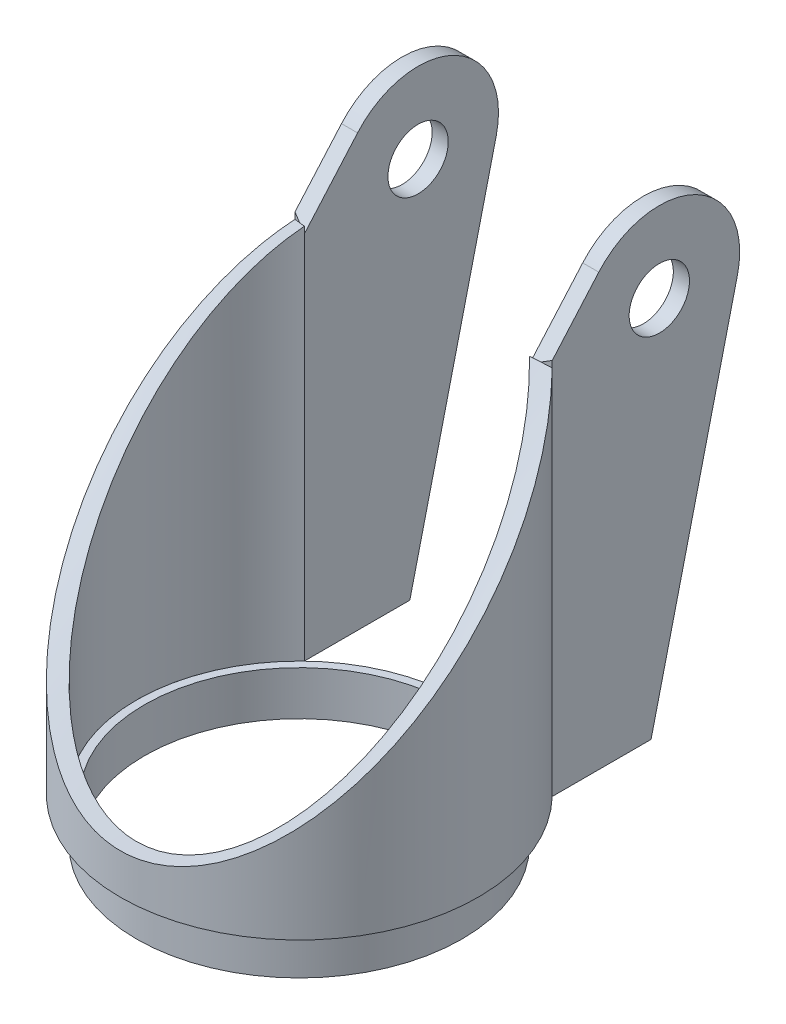
ISO-10303-21;
HEADER;
FILE_DESCRIPTION(('STEP AP214'),'2;1');
FILE_NAME('part.step','',(''),(''),'','','');
FILE_SCHEMA(('AUTOMOTIVE_DESIGN { 1 0 10303 214 1 1 1 1 }'));
ENDSEC;
DATA;
#1=APPLICATION_CONTEXT('core data for automotive mechanical design processes');
#2=APPLICATION_PROTOCOL_DEFINITION('international standard','automotive_design',2000,#1);
#3=PRODUCT_CONTEXT('',#1,'mechanical');
#4=PRODUCT('Part','Part','',(#3));
#5=PRODUCT_RELATED_PRODUCT_CATEGORY('part','',(#4));
#6=PRODUCT_DEFINITION_FORMATION('','',#4);
#7=PRODUCT_DEFINITION_CONTEXT('part definition',#1,'design');
#8=PRODUCT_DEFINITION('design','',#6,#7);
#9=PRODUCT_DEFINITION_SHAPE('','',#8);
#10=(LENGTH_UNIT() NAMED_UNIT(*) SI_UNIT(.MILLI.,.METRE.));
#11=(NAMED_UNIT(*) PLANE_ANGLE_UNIT() SI_UNIT($,.RADIAN.));
#12=(NAMED_UNIT(*) SI_UNIT($,.STERADIAN.) SOLID_ANGLE_UNIT());
#13=UNCERTAINTY_MEASURE_WITH_UNIT(LENGTH_MEASURE(1.E-05),#10,'distance_accuracy_value','');
#14=(GEOMETRIC_REPRESENTATION_CONTEXT(3) GLOBAL_UNCERTAINTY_ASSIGNED_CONTEXT((#13)) GLOBAL_UNIT_ASSIGNED_CONTEXT((#10,
#11,#12)) REPRESENTATION_CONTEXT('',''));
#15=CARTESIAN_POINT('',(0.,0.,0.));
#16=DIRECTION('',(0.,0.,1.));
#17=DIRECTION('',(1.,0.,0.));
#18=AXIS2_PLACEMENT_3D('',#15,#16,#17);
#19=CARTESIAN_POINT('',(0.,-11.,0.));
#20=DIRECTION('',(0.,-1.,0.));
#21=DIRECTION('',(0.,0.,-1.));
#22=AXIS2_PLACEMENT_3D('',#19,#20,#21);
#23=PLANE('',#22);
#24=CARTESIAN_POINT('',(0.,-11.,0.));
#25=DIRECTION('',(0.,-1.,0.));
#26=DIRECTION('',(0.,0.,-1.));
#27=AXIS2_PLACEMENT_3D('',#24,#25,#26);
#28=CIRCLE('',#27,40.5);
#29=CARTESIAN_POINT('',(0.,-11.,-40.5));
#30=VERTEX_POINT('',#29);
#31=EDGE_CURVE('E12',#30,#30,#28,.T.);
#32=ORIENTED_EDGE('',*,*,#31,.T.);
#33=EDGE_LOOP('',(#32));
#34=FACE_BOUND('',#33,.T.);
#35=CARTESIAN_POINT('',(0.,-11.,0.));
#36=DIRECTION('',(0.,-1.,0.));
#37=DIRECTION('',(1.,0.,0.));
#38=AXIS2_PLACEMENT_3D('',#35,#36,#37);
#39=CIRCLE('',#38,38.5);
#40=CARTESIAN_POINT('',(38.5,-11.,0.));
#41=VERTEX_POINT('',#40);
#42=EDGE_CURVE('E62',#41,#41,#39,.T.);
#43=ORIENTED_EDGE('',*,*,#42,.F.);
#44=EDGE_LOOP('',(#43));
#45=FACE_BOUND('',#44,.T.);
#46=ADVANCED_FACE('F51',(#34,#45),#23,.T.);
#47=CARTESIAN_POINT('',(0.,0.,0.));
#48=DIRECTION('',(0.,-1.,0.));
#49=DIRECTION('',(0.,0.,-1.));
#50=AXIS2_PLACEMENT_3D('',#47,#48,#49);
#51=PLANE('',#50);
#52=CARTESIAN_POINT('',(0.,0.,0.));
#53=DIRECTION('',(0.,-1.,0.));
#54=DIRECTION('',(0.,0.,-1.));
#55=AXIS2_PLACEMENT_3D('',#52,#53,#54);
#56=CIRCLE('',#55,40.5);
#57=CARTESIAN_POINT('',(0.,0.,-40.5));
#58=VERTEX_POINT('',#57);
#59=EDGE_CURVE('E55',#58,#58,#56,.T.);
#60=ORIENTED_EDGE('',*,*,#59,.F.);
#61=EDGE_LOOP('',(#60));
#62=FACE_BOUND('',#61,.T.);
#63=CARTESIAN_POINT('',(0.,0.,0.));
#64=DIRECTION('',(0.,-1.,0.));
#65=DIRECTION('',(1.,0.,0.));
#66=AXIS2_PLACEMENT_3D('',#63,#64,#65);
#67=CIRCLE('',#66,38.5);
#68=CARTESIAN_POINT('',(38.5,0.,0.));
#69=VERTEX_POINT('',#68);
#70=EDGE_CURVE('E64',#69,#69,#67,.T.);
#71=ORIENTED_EDGE('',*,*,#70,.T.);
#72=EDGE_LOOP('',(#71));
#73=FACE_BOUND('',#72,.T.);
#74=ADVANCED_FACE('F74',(#62,#73),#51,.F.);
#75=CARTESIAN_POINT('',(0.,-11.,0.));
#76=DIRECTION('',(0.,1.,0.));
#77=DIRECTION('',(0.,0.,1.));
#78=AXIS2_PLACEMENT_3D('',#75,#76,#77);
#79=CYLINDRICAL_SURFACE('',#78,40.5);
#80=ORIENTED_EDGE('',*,*,#31,.F.);
#81=EDGE_LOOP('',(#80));
#82=FACE_BOUND('',#81,.T.);
#83=ORIENTED_EDGE('',*,*,#59,.T.);
#84=EDGE_LOOP('',(#83));
#85=FACE_BOUND('',#84,.T.);
#86=ADVANCED_FACE('F53',(#82,#85),#79,.T.);
#87=CARTESIAN_POINT('',(0.,-11.,0.));
#88=DIRECTION('',(0.,1.,0.));
#89=DIRECTION('',(0.,0.,1.));
#90=AXIS2_PLACEMENT_3D('',#87,#88,#89);
#91=CYLINDRICAL_SURFACE('',#90,38.5);
#92=ORIENTED_EDGE('',*,*,#42,.T.);
#93=EDGE_LOOP('',(#92));
#94=FACE_BOUND('',#93,.T.);
#95=ORIENTED_EDGE('',*,*,#70,.F.);
#96=EDGE_LOOP('',(#95));
#97=FACE_BOUND('',#96,.T.);
#98=ADVANCED_FACE('F70',(#94,#97),#91,.F.);
#99=CLOSED_SHELL('',(#46,#74,#86,#98));
#100=MANIFOLD_SOLID_BREP('B2',#99);
#101=CARTESIAN_POINT('',(28.,0.,-29.2617497767991));
#102=DIRECTION('',(0.388108434103409,0.,0.92161371700827));
#103=DIRECTION('',(0.,-1.,0.));
#104=AXIS2_PLACEMENT_3D('',#101,#102,#103);
#105=PLANE('',#104);
#106=CARTESIAN_POINT('',(30.,92.9975889379321,-30.1039864469808));
#107=CARTESIAN_POINT('',(29.8885103333062,93.0345706248091,-30.0570361041628));
#108=CARTESIAN_POINT('',(29.7770804874695,93.0717647070968,-30.0101109530046));
#109=CARTESIAN_POINT('',(29.554346201784,93.1465812140543,-29.9163134614492));
#110=CARTESIAN_POINT('',(29.4430417587286,93.1842036274844,-29.8694411197014));
#111=CARTESIAN_POINT('',(29.2205596968486,93.2598817767092,-29.7757498442149));
#112=CARTESIAN_POINT('',(29.1093820763432,93.2979375066855,-29.7289309097683));
#113=CARTESIAN_POINT('',(28.887155020563,93.3744872694543,-29.635347022026));
#114=CARTESIAN_POINT('',(28.7761055853392,93.4129813024211,-29.5885820687518));
#115=CARTESIAN_POINT('',(28.5541364336139,93.4904125817496,-29.4951067891357));
#116=CARTESIAN_POINT('',(28.4432167188192,93.5293498338727,-29.4483964635127));
#117=CARTESIAN_POINT('',(28.2215084780798,93.6076724422981,-29.3550310582966));
#118=CARTESIAN_POINT('',(28.1107199557139,93.6470578105274,-29.3083759802107));
#119=CARTESIAN_POINT('',(28.,93.6866688897611,-29.2617497767991));
#120=B_SPLINE_CURVE_WITH_KNOTS('',3,(#106,#107,#108,#109,#110,#111,#112,#113,#114,#115,#116,
#117,#118,#119),.UNSPECIFIED.,.F.,.F.,(4,2,2,2,2,2,4),(0.,0.379495988719009,0.758982042079018,
1.13846300583357,1.51794412055661,1.89743017391594,2.27692635129782),.UNSPECIFIED.);
#121=CARTESIAN_POINT('',(28.,93.6866688897611,-29.2617497767991));
#122=VERTEX_POINT('',#121);
#123=CARTESIAN_POINT('',(30.,92.9975889379321,-30.1039864469808));
#124=VERTEX_POINT('',#123);
#125=EDGE_CURVE('E129',#122,#124,#120,.F.);
#126=ORIENTED_EDGE('',*,*,#125,.T.);
#127=DIRECTION('',(0.842423842952178,0.405545708515072,-0.354760126184853));
#128=VECTOR('',#127,1.);
#129=CARTESIAN_POINT('',(28.,92.0347821230302,-29.2617497767991));
#130=LINE('',#129,#128);
#131=CARTESIAN_POINT('',(28.,92.0347821230302,-29.2617497767991));
#132=VERTEX_POINT('',#131);
#133=EDGE_CURVE('E365',#132,#124,#130,.T.);
#134=ORIENTED_EDGE('',*,*,#133,.F.);
#135=DIRECTION('',(0.,1.,0.));
#136=VECTOR('',#135,1.);
#137=CARTESIAN_POINT('',(28.,0.,-29.2617497767991));
#138=LINE('',#137,#136);
#139=EDGE_CURVE('E278',#132,#122,#138,.T.);
#140=ORIENTED_EDGE('',*,*,#139,.T.);
#141=EDGE_LOOP('',(#126,#134,#140));
#142=FACE_BOUND('',#141,.T.);
#143=ADVANCED_FACE('F113',(#142),#105,.F.);
#144=CARTESIAN_POINT('',(-28.,0.,-29.2617497767991));
#145=DIRECTION('',(-0.388108434103418,0.,0.921613717008266));
#146=DIRECTION('',(0.,-1.,0.));
#147=AXIS2_PLACEMENT_3D('',#144,#145,#146);
#148=PLANE('',#147);
#149=DIRECTION('',(0.842423842952178,-0.405545708515072,0.354760126184853));
#150=VECTOR('',#149,1.);
#151=CARTESIAN_POINT('',(-30.,92.9975889379321,-30.1039864469808));
#152=LINE('',#151,#150);
#153=CARTESIAN_POINT('',(-28.,92.0347821230302,-29.2617497767991));
#154=VERTEX_POINT('',#153);
#155=CARTESIAN_POINT('',(-30.,92.9975889379321,-30.1039864469808));
#156=VERTEX_POINT('',#155);
#157=EDGE_CURVE('E137',#154,#156,#152,.F.);
#158=ORIENTED_EDGE('',*,*,#157,.T.);
#159=CARTESIAN_POINT('',(-28.,93.6866688897611,-29.2617497767991));
#160=CARTESIAN_POINT('',(-28.1107199557139,93.6470578105274,-29.3083759802107));
#161=CARTESIAN_POINT('',(-28.2215084780799,93.6076724422981,-29.3550310582966));
#162=CARTESIAN_POINT('',(-28.4432167188192,93.5293498338727,-29.4483964635127));
#163=CARTESIAN_POINT('',(-28.5541364336139,93.4904125817496,-29.4951067891357));
#164=CARTESIAN_POINT('',(-28.7761055853393,93.4129813024211,-29.5885820687519));
#165=CARTESIAN_POINT('',(-28.887155020563,93.3744872694543,-29.6353470220261));
#166=CARTESIAN_POINT('',(-29.1093820763432,93.2979375066855,-29.7289309097684));
#167=CARTESIAN_POINT('',(-29.2205596968486,93.2598817767092,-29.775749844215));
#168=CARTESIAN_POINT('',(-29.4430417587286,93.1842036274844,-29.8694411197014));
#169=CARTESIAN_POINT('',(-29.5543462017841,93.1465812140543,-29.9163134614492));
#170=CARTESIAN_POINT('',(-29.7770804874695,93.0717647070968,-30.0101109530047));
#171=CARTESIAN_POINT('',(-29.8885103333062,93.0345706248091,-30.0570361041629));
#172=CARTESIAN_POINT('',(-30.,92.9975889379321,-30.1039864469808));
#173=B_SPLINE_CURVE_WITH_KNOTS('',3,(#159,#160,#161,#162,#163,#164,#165,#166,#167,#168,#169,
#170,#171,#172),.UNSPECIFIED.,.F.,.F.,(4,2,2,2,2,2,4),(0.,0.379496177381876,0.758982230741217,
1.13846334546426,1.51794430921881,1.89743036257882,2.27692635129782),.UNSPECIFIED.);
#174=CARTESIAN_POINT('',(-28.,93.6866688897611,-29.2617497767991));
#175=VERTEX_POINT('',#174);
#176=EDGE_CURVE('E226',#175,#156,#173,.T.);
#177=ORIENTED_EDGE('',*,*,#176,.F.);
#178=DIRECTION('',(0.,1.,0.));
#179=VECTOR('',#178,1.);
#180=CARTESIAN_POINT('',(-28.,0.,-29.2617497767991));
#181=LINE('',#180,#179);
#182=EDGE_CURVE('E292',#175,#154,#181,.F.);
#183=ORIENTED_EDGE('',*,*,#182,.T.);
#184=EDGE_LOOP('',(#158,#177,#183));
#185=FACE_BOUND('',#184,.T.);
#186=ADVANCED_FACE('F402',(#185),#148,.F.);
#187=CARTESIAN_POINT('',(30.,0.,-30.1039864469808));
#188=DIRECTION('',(0.,-1.,0.));
#189=DIRECTION('',(0.,0.,-1.));
#190=AXIS2_PLACEMENT_3D('',#187,#188,#189);
#191=PLANE('',#190);
#192=DIRECTION('',(0.,0.,-1.));
#193=VECTOR('',#192,1.);
#194=CARTESIAN_POINT('',(32.,0.,-57.553232891391));
#195=LINE('',#194,#193);
#196=CARTESIAN_POINT('',(32.,0.,-30.9232921921325));
#197=VERTEX_POINT('',#196);
#198=CARTESIAN_POINT('',(32.,0.,-55.5));
#199=VERTEX_POINT('',#198);
#200=EDGE_CURVE('E263',#197,#199,#195,.T.);
#201=ORIENTED_EDGE('',*,*,#200,.F.);
#202=CARTESIAN_POINT('',(0.,0.,0.));
#203=DIRECTION('',(0.,1.,0.));
#204=DIRECTION('',(0.,0.,1.));
#205=AXIS2_PLACEMENT_3D('',#202,#203,#204);
#206=CIRCLE('',#205,44.5);
#207=CARTESIAN_POINT('',(-32.,0.,-30.9232921921325));
#208=VERTEX_POINT('',#207);
#209=EDGE_CURVE('E219',#208,#197,#206,.T.);
#210=ORIENTED_EDGE('',*,*,#209,.F.);
#211=DIRECTION('',(0.,0.,-1.));
#212=VECTOR('',#211,1.);
#213=CARTESIAN_POINT('',(-32.,0.,-57.553232891391));
#214=LINE('',#213,#212);
#215=CARTESIAN_POINT('',(-32.,0.,-55.5));
#216=VERTEX_POINT('',#215);
#217=EDGE_CURVE('E245',#208,#216,#214,.T.);
#218=ORIENTED_EDGE('',*,*,#217,.T.);
#219=DIRECTION('',(-1.,0.,0.));
#220=VECTOR('',#219,1.);
#221=CARTESIAN_POINT('',(-30.,0.,-55.5));
#222=LINE('',#221,#220);
#223=CARTESIAN_POINT('',(-28.,0.,-55.5));
#224=VERTEX_POINT('',#223);
#225=EDGE_CURVE('E49',#224,#216,#222,.T.);
#226=ORIENTED_EDGE('',*,*,#225,.F.);
#227=DIRECTION('',(0.,0.,-1.));
#228=VECTOR('',#227,1.);
#229=CARTESIAN_POINT('',(-28.,0.,-57.553232891391));
#230=LINE('',#229,#228);
#231=CARTESIAN_POINT('',(-28.,0.,-29.2617497767991));
#232=VERTEX_POINT('',#231);
#233=EDGE_CURVE('E282',#232,#224,#230,.T.);
#234=ORIENTED_EDGE('',*,*,#233,.F.);
#235=CARTESIAN_POINT('',(0.,0.,0.));
#236=DIRECTION('',(0.,1.,0.));
#237=DIRECTION('',(0.,0.,1.));
#238=AXIS2_PLACEMENT_3D('',#235,#236,#237);
#239=CIRCLE('',#238,40.5);
#240=CARTESIAN_POINT('',(28.,0.,-29.2617497767991));
#241=VERTEX_POINT('',#240);
#242=EDGE_CURVE('E302',#232,#241,#239,.T.);
#243=ORIENTED_EDGE('',*,*,#242,.T.);
#244=DIRECTION('',(0.,0.,-1.));
#245=VECTOR('',#244,1.);
#246=CARTESIAN_POINT('',(28.,0.,-57.553232891391));
#247=LINE('',#246,#245);
#248=CARTESIAN_POINT('',(28.,0.,-55.5));
#249=VERTEX_POINT('',#248);
#250=EDGE_CURVE('E306',#241,#249,#247,.T.);
#251=ORIENTED_EDGE('',*,*,#250,.T.);
#252=DIRECTION('',(1.,0.,0.));
#253=VECTOR('',#252,1.);
#254=CARTESIAN_POINT('',(30.,0.,-55.5));
#255=LINE('',#254,#253);
#256=EDGE_CURVE('E122',#249,#199,#255,.T.);
#257=ORIENTED_EDGE('',*,*,#256,.T.);
#258=EDGE_LOOP('',(#201,#210,#218,#226,#234,#243,#251,#257));
#259=FACE_BOUND('',#258,.T.);
#260=ADVANCED_FACE('F378',(#259),#191,.T.);
#261=CARTESIAN_POINT('',(30.,89.3199517094916,-76.9979532030466));
#262=DIRECTION('',(0.,-0.23400241452542,-0.972236015582777));
#263=DIRECTION('',(0.,0.972236015582777,-0.23400241452542));
#264=AXIS2_PLACEMENT_3D('',#261,#262,#263);
#265=PLANE('',#264);
#266=ORIENTED_EDGE('',*,*,#256,.F.);
#267=DIRECTION('',(0.,0.972236015582777,-0.23400241452542));
#268=VECTOR('',#267,1.);
#269=CARTESIAN_POINT('',(28.,89.3199517094916,-76.9979532030466));
#270=LINE('',#269,#268);
#271=CARTESIAN_POINT('',(28.,89.3199517094916,-76.9979532030466));
#272=VERTEX_POINT('',#271);
#273=EDGE_CURVE('E311',#249,#272,#270,.T.);
#274=ORIENTED_EDGE('',*,*,#273,.T.);
#275=DIRECTION('',(1.,0.,0.));
#276=VECTOR('',#275,1.);
#277=CARTESIAN_POINT('',(30.,89.3199517094916,-76.9979532030466));
#278=LINE('',#277,#276);
#279=CARTESIAN_POINT('',(32.,89.3199517094916,-76.9979532030466));
#280=VERTEX_POINT('',#279);
#281=EDGE_CURVE('E374',#272,#280,#278,.T.);
#282=ORIENTED_EDGE('',*,*,#281,.T.);
#283=DIRECTION('',(0.,0.972236015582777,-0.23400241452542));
#284=VECTOR('',#283,1.);
#285=CARTESIAN_POINT('',(32.,89.3199517094916,-76.9979532030466));
#286=LINE('',#285,#284);
#287=EDGE_CURVE('E268',#199,#280,#286,.T.);
#288=ORIENTED_EDGE('',*,*,#287,.F.);
#289=EDGE_LOOP('',(#266,#274,#282,#288));
#290=FACE_BOUND('',#289,.T.);
#291=ADVANCED_FACE('F386',(#290),#265,.T.);
#292=CARTESIAN_POINT('',(30.,94.,-57.553232891391));
#293=DIRECTION('',(1.,0.,0.));
#294=DIRECTION('',(0.,0.,-1.));
#295=AXIS2_PLACEMENT_3D('',#292,#293,#294);
#296=CYLINDRICAL_SURFACE('',#295,20.);
#297=ORIENTED_EDGE('',*,*,#281,.F.);
#298=CARTESIAN_POINT('',(28.,94.,-57.553232891391));
#299=DIRECTION('',(1.,0.,0.));
#300=DIRECTION('',(0.,0.,-1.));
#301=AXIS2_PLACEMENT_3D('',#298,#299,#300);
#302=CIRCLE('',#301,20.);
#303=CARTESIAN_POINT('',(28.,107.168150193461,-42.5));
#304=VERTEX_POINT('',#303);
#305=EDGE_CURVE('E307',#272,#304,#302,.T.);
#306=ORIENTED_EDGE('',*,*,#305,.T.);
#307=DIRECTION('',(1.,0.,0.));
#308=VECTOR('',#307,1.);
#309=CARTESIAN_POINT('',(30.,107.168150193461,-42.5));
#310=LINE('',#309,#308);
#311=CARTESIAN_POINT('',(32.,107.168150193461,-42.5));
#312=VERTEX_POINT('',#311);
#313=EDGE_CURVE('E364',#304,#312,#310,.T.);
#314=ORIENTED_EDGE('',*,*,#313,.T.);
#315=CARTESIAN_POINT('',(32.,94.,-57.553232891391));
#316=DIRECTION('',(1.,0.,0.));
#317=DIRECTION('',(0.,0.,-1.));
#318=AXIS2_PLACEMENT_3D('',#315,#316,#317);
#319=CIRCLE('',#318,20.);
#320=EDGE_CURVE('E264',#280,#312,#319,.T.);
#321=ORIENTED_EDGE('',*,*,#320,.F.);
#322=EDGE_LOOP('',(#297,#306,#314,#321));
#323=FACE_BOUND('',#322,.T.);
#324=ADVANCED_FACE('F389',(#323),#296,.T.);
#325=CARTESIAN_POINT('',(30.,107.168150193461,-42.5));
#326=DIRECTION('',(0.,0.658407509673038,0.752661644569556));
#327=DIRECTION('',(0.,-0.752661644569556,0.658407509673038));
#328=AXIS2_PLACEMENT_3D('',#325,#326,#327);
#329=PLANE('',#328);
#330=ORIENTED_EDGE('',*,*,#313,.F.);
#331=DIRECTION('',(0.,-0.752661644569556,0.658407509673038));
#332=VECTOR('',#331,1.);
#333=CARTESIAN_POINT('',(28.,107.168150193461,-42.5));
#334=LINE('',#333,#332);
#335=EDGE_CURVE('E303',#304,#132,#334,.T.);
#336=ORIENTED_EDGE('',*,*,#335,.T.);
#337=ORIENTED_EDGE('',*,*,#133,.T.);
#338=DIRECTION('',(0.849069856551713,0.397616535472688,-0.347823905753976));
#339=VECTOR('',#338,1.);
#340=CARTESIAN_POINT('',(30.,92.9975889379321,-30.1039864469808));
#341=LINE('',#340,#339);
#342=CARTESIAN_POINT('',(32.,93.9341821579234,-30.9232921921325));
#343=VERTEX_POINT('',#342);
#344=EDGE_CURVE('E363',#124,#343,#341,.T.);
#345=ORIENTED_EDGE('',*,*,#344,.T.);
#346=DIRECTION('',(0.,-0.752661644569556,0.658407509673038));
#347=VECTOR('',#346,1.);
#348=CARTESIAN_POINT('',(32.,107.168150193461,-42.5));
#349=LINE('',#348,#347);
#350=EDGE_CURVE('E260',#312,#343,#349,.T.);
#351=ORIENTED_EDGE('',*,*,#350,.F.);
#352=EDGE_LOOP('',(#330,#336,#337,#345,#351));
#353=FACE_BOUND('',#352,.T.);
#354=ADVANCED_FACE('F395',(#353),#329,.T.);
#355=CARTESIAN_POINT('',(32.,0.,-30.9232921921325));
#356=DIRECTION('',(-0.37907827128595,0.,-0.925364611512055));
#357=DIRECTION('',(0.,-1.,0.));
#358=AXIS2_PLACEMENT_3D('',#355,#356,#357);
#359=PLANE('',#358);
#360=ORIENTED_EDGE('',*,*,#344,.F.);
#361=CARTESIAN_POINT('',(30.,92.9975889379321,-30.1039864469808));
#362=CARTESIAN_POINT('',(30.1661377400848,92.9413951810394,-30.1720452494498));
#363=CARTESIAN_POINT('',(30.3324120038965,92.8856730977594,-30.2401599792557));
#364=CARTESIAN_POINT('',(30.6652203606715,92.7751591592949,-30.3764958786258));
#365=CARTESIAN_POINT('',(30.83175444683,92.7203672801799,-30.4447170454024));
#366=CARTESIAN_POINT('',(31.1650951338357,92.6116920829908,-30.5812710153807));
#367=CARTESIAN_POINT('',(31.3319017612361,92.5578088600491,-30.64960382946));
#368=CARTESIAN_POINT('',(31.6657659222847,92.4509406865651,-30.7863722420836));
#369=CARTESIAN_POINT('',(31.8328234622876,92.3979557592059,-30.8548078432313));
#370=CARTESIAN_POINT('',(32.,92.3454133012406,-30.9232921921325));
#371=B_SPLINE_CURVE_WITH_KNOTS('',3,(#361,#362,#363,#364,#365,#366,#367,#368,#369,#370),
.UNSPECIFIED.,.F.,.F.,(4,2,2,2,4),(0.,0.564377983934947,1.12874142654943,1.69316359328638,
2.25760030438001),.UNSPECIFIED.);
#372=CARTESIAN_POINT('',(32.,92.3454133012406,-30.9232921921325));
#373=VERTEX_POINT('',#372);
#374=EDGE_CURVE('E228',#124,#373,#371,.T.);
#375=ORIENTED_EDGE('',*,*,#374,.T.);
#376=DIRECTION('',(0.,1.,0.));
#377=VECTOR('',#376,1.);
#378=CARTESIAN_POINT('',(32.,0.,-30.9232921921325));
#379=LINE('',#378,#377);
#380=EDGE_CURVE('E237',#373,#343,#379,.T.);
#381=ORIENTED_EDGE('',*,*,#380,.T.);
#382=EDGE_LOOP('',(#360,#375,#381));
#383=FACE_BOUND('',#382,.T.);
#384=ADVANCED_FACE('F341',(#383),#359,.F.);
#385=CARTESIAN_POINT('',(0.,107.168150193461,-44.5));
#386=CARTESIAN_POINT('',(0.,107.168150193461,-43.1666666666667));
#387=CARTESIAN_POINT('',(0.,107.168150193461,-41.8333333333333));
#388=CARTESIAN_POINT('',(0.,107.168150193461,-40.5));
#389=CARTESIAN_POINT('',(-89.,107.168150193461,-44.5));
#390=CARTESIAN_POINT('',(-86.3333333333334,107.168150193461,-43.1666666666667));
#391=CARTESIAN_POINT('',(-83.6666666666667,107.168150193461,-41.8333333333334));
#392=CARTESIAN_POINT('',(-81.,107.168150193461,-40.5));
#393=CARTESIAN_POINT('',(-89.,9.99999999999997,44.5));
#394=CARTESIAN_POINT('',(-86.3333333333334,9.99999999999997,43.1666666666667));
#395=CARTESIAN_POINT('',(-83.6666666666667,9.99999999999997,41.8333333333334));
#396=CARTESIAN_POINT('',(-81.,9.99999999999997,40.5));
#397=CARTESIAN_POINT('',(0.,9.99999999999998,44.5));
#398=CARTESIAN_POINT('',(0.,9.99999999999998,43.1666666666667));
#399=CARTESIAN_POINT('',(0.,9.99999999999998,41.8333333333333));
#400=CARTESIAN_POINT('',(0.,9.99999999999998,40.5));
#401=CARTESIAN_POINT('',(89.,9.99999999999999,44.5));
#402=CARTESIAN_POINT('',(86.3333333333334,10.,43.1666666666667));
#403=CARTESIAN_POINT('',(83.6666666666667,10.,41.8333333333333));
#404=CARTESIAN_POINT('',(81.,9.99999999999999,40.5));
#405=CARTESIAN_POINT('',(89.,107.168150193461,-44.5));
#406=CARTESIAN_POINT('',(86.3333333333334,107.168150193461,-43.1666666666667));
#407=CARTESIAN_POINT('',(83.6666666666667,107.168150193461,-41.8333333333334));
#408=CARTESIAN_POINT('',(81.,107.168150193461,-40.5));
#409=CARTESIAN_POINT('',(0.,107.168150193461,-44.5));
#410=CARTESIAN_POINT('',(0.,107.168150193461,-43.1666666666667));
#411=CARTESIAN_POINT('',(0.,107.168150193461,-41.8333333333333));
#412=CARTESIAN_POINT('',(0.,107.168150193461,-40.5));
#413=(BOUNDED_SURFACE() B_SPLINE_SURFACE(3,3,((#385,#386,#387,#388),(#389,#390,#391,#392),(#393,
#394,#395,#396),(#397,#398,#399,#400),(#401,#402,#403,#404),(#405,#406,#407,#408),(#409,#410,
#411,#412)),.UNSPECIFIED.,.T.,.F.,.F.) B_SPLINE_SURFACE_WITH_KNOTS((4,3,4),(4,4),(0.,0.5,1.),
(0.,1.),.UNSPECIFIED.) GEOMETRIC_REPRESENTATION_ITEM() RATIONAL_B_SPLINE_SURFACE(((1.,1.,1.,1.),
(0.333333333333333,0.333333333333333,0.333333333333333,0.333333333333333),(0.333333333333333,
0.333333333333333,0.333333333333333,0.333333333333333),(1.,1.,1.,1.),(0.333333333333333,
0.333333333333333,0.333333333333333,0.333333333333333),(0.333333333333333,0.333333333333333,
0.333333333333333,0.333333333333333),(1.,1.,1.,1.))) REPRESENTATION_ITEM('') SURFACE());
#414=CARTESIAN_POINT('',(-30.,92.9975889379321,-30.1039864469808));
#415=CARTESIAN_POINT('',(-30.1661377400848,92.9413951810393,-30.1720452494498));
#416=CARTESIAN_POINT('',(-30.3324120038965,92.8856730977593,-30.2401599792556));
#417=CARTESIAN_POINT('',(-30.6652203606715,92.7751591592949,-30.3764958786258));
#418=CARTESIAN_POINT('',(-30.83175444683,92.7203672801799,-30.4447170454024));
#419=CARTESIAN_POINT('',(-31.1650951338357,92.6116920829909,-30.5812710153807));
#420=CARTESIAN_POINT('',(-31.3319017612361,92.5578088600491,-30.64960382946));
#421=CARTESIAN_POINT('',(-31.6657659222847,92.4509406865651,-30.7863722420836));
#422=CARTESIAN_POINT('',(-31.8328234622876,92.3979557592058,-30.8548078432313));
#423=CARTESIAN_POINT('',(-32.,92.3454133012406,-30.9232921921325));
#424=B_SPLINE_CURVE_WITH_KNOTS('',3,(#414,#415,#416,#417,#418,#419,#420,#421,#422,#423),
.UNSPECIFIED.,.F.,.F.,(4,2,2,2,4),(0.,0.564377983934962,1.12874142654945,1.69316359328639,
2.25760030437999),.UNSPECIFIED.);
#425=CARTESIAN_POINT('',(-32.,92.3454133012406,-30.9232921921325));
#426=VERTEX_POINT('',#425);
#427=EDGE_CURVE('E223',#156,#426,#424,.T.);
#428=CARTESIAN_POINT('',(0.,58.5840750967304,0.));
#429=DIRECTION('',(0.,-0.675432585140296,-0.737421740207526));
#430=DIRECTION('',(0.,0.737421740207526,-0.675432585140296));
#431=AXIS2_PLACEMENT_3D('',#428,#429,#430);
#432=ELLIPSE('',#431,65.8837032429473,44.5);
#433=EDGE_CURVE('E210',#426,#373,#432,.F.);
#434=CARTESIAN_POINT('',(0.,58.5840750967304,0.));
#435=DIRECTION('',(0.,-0.64030821461979,-0.768118083559044));
#436=DIRECTION('',(0.,0.768118083559043,-0.64030821461979));
#437=AXIS2_PLACEMENT_3D('',#434,#435,#436);
#438=ELLIPSE('',#437,63.2507893468907,40.5);
#439=EDGE_CURVE('E288',#175,#122,#438,.F.);
#440=ORIENTED_EDGE('',*,*,#427,.T.);
#441=ORIENTED_EDGE('',*,*,#433,.T.);
#442=ORIENTED_EDGE('',*,*,#374,.F.);
#443=ORIENTED_EDGE('',*,*,#125,.F.);
#444=ORIENTED_EDGE('',*,*,#439,.F.);
#445=ORIENTED_EDGE('',*,*,#176,.T.);
#446=EDGE_LOOP('',(#440,#441,#442,#443,#444,#445));
#447=FACE_BOUND('',#446,.T.);
#448=ADVANCED_FACE('F225',(#447),#413,.T.);
#449=CARTESIAN_POINT('',(-32.,0.,-30.9232921921325));
#450=DIRECTION('',(0.379078271285951,0.,-0.925364611512054));
#451=DIRECTION('',(0.,-1.,0.));
#452=AXIS2_PLACEMENT_3D('',#449,#450,#451);
#453=PLANE('',#452);
#454=ORIENTED_EDGE('',*,*,#427,.F.);
#455=DIRECTION('',(-0.849069856551713,0.397616535472688,-0.347823905753976));
#456=VECTOR('',#455,1.);
#457=CARTESIAN_POINT('',(-30.,92.9975889379321,-30.1039864469808));
#458=LINE('',#457,#456);
#459=CARTESIAN_POINT('',(-32.,93.9341821579234,-30.9232921921325));
#460=VERTEX_POINT('',#459);
#461=EDGE_CURVE('E233',#156,#460,#458,.T.);
#462=ORIENTED_EDGE('',*,*,#461,.T.);
#463=DIRECTION('',(0.,1.,0.));
#464=VECTOR('',#463,1.);
#465=CARTESIAN_POINT('',(-32.,0.,-30.9232921921325));
#466=LINE('',#465,#464);
#467=EDGE_CURVE('E231',#460,#426,#466,.F.);
#468=ORIENTED_EDGE('',*,*,#467,.T.);
#469=EDGE_LOOP('',(#454,#462,#468));
#470=FACE_BOUND('',#469,.T.);
#471=ADVANCED_FACE('F232',(#470),#453,.F.);
#472=CARTESIAN_POINT('',(-30.,107.168150193461,-42.5));
#473=DIRECTION('',(0.,-0.658407509673038,-0.752661644569556));
#474=DIRECTION('',(0.,-0.752661644569556,0.658407509673038));
#475=AXIS2_PLACEMENT_3D('',#472,#473,#474);
#476=PLANE('',#475);
#477=ORIENTED_EDGE('',*,*,#157,.F.);
#478=DIRECTION('',(0.,-0.752661644569556,0.658407509673038));
#479=VECTOR('',#478,1.);
#480=CARTESIAN_POINT('',(-28.,107.168150193461,-42.5));
#481=LINE('',#480,#479);
#482=CARTESIAN_POINT('',(-28.,107.168150193461,-42.5));
#483=VERTEX_POINT('',#482);
#484=EDGE_CURVE('E283',#483,#154,#481,.T.);
#485=ORIENTED_EDGE('',*,*,#484,.F.);
#486=DIRECTION('',(-1.,0.,0.));
#487=VECTOR('',#486,1.);
#488=CARTESIAN_POINT('',(-30.,107.168150193461,-42.5));
#489=LINE('',#488,#487);
#490=CARTESIAN_POINT('',(-32.,107.168150193461,-42.5));
#491=VERTEX_POINT('',#490);
#492=EDGE_CURVE('E324',#483,#491,#489,.T.);
#493=ORIENTED_EDGE('',*,*,#492,.T.);
#494=DIRECTION('',(0.,-0.752661644569556,0.658407509673038));
#495=VECTOR('',#494,1.);
#496=CARTESIAN_POINT('',(-32.,107.168150193461,-42.5));
#497=LINE('',#496,#495);
#498=EDGE_CURVE('E246',#491,#460,#497,.T.);
#499=ORIENTED_EDGE('',*,*,#498,.T.);
#500=ORIENTED_EDGE('',*,*,#461,.F.);
#501=EDGE_LOOP('',(#477,#485,#493,#499,#500));
#502=FACE_BOUND('',#501,.T.);
#503=ADVANCED_FACE('F439',(#502),#476,.F.);
#504=CARTESIAN_POINT('',(-30.,94.,-57.553232891391));
#505=DIRECTION('',(-1.,0.,0.));
#506=DIRECTION('',(0.,0.,1.));
#507=AXIS2_PLACEMENT_3D('',#504,#505,#506);
#508=CYLINDRICAL_SURFACE('',#507,20.);
#509=ORIENTED_EDGE('',*,*,#492,.F.);
#510=CARTESIAN_POINT('',(-28.,94.,-57.553232891391));
#511=DIRECTION('',(1.,0.,0.));
#512=DIRECTION('',(0.,0.,-1.));
#513=AXIS2_PLACEMENT_3D('',#510,#511,#512);
#514=CIRCLE('',#513,20.);
#515=CARTESIAN_POINT('',(-28.,89.3199517094916,-76.9979532030466));
#516=VERTEX_POINT('',#515);
#517=EDGE_CURVE('E291',#516,#483,#514,.T.);
#518=ORIENTED_EDGE('',*,*,#517,.F.);
#519=DIRECTION('',(-1.,0.,0.));
#520=VECTOR('',#519,1.);
#521=CARTESIAN_POINT('',(-30.,89.3199517094916,-76.9979532030466));
#522=LINE('',#521,#520);
#523=CARTESIAN_POINT('',(-32.,89.3199517094916,-76.9979532030466));
#524=VERTEX_POINT('',#523);
#525=EDGE_CURVE('E117',#516,#524,#522,.T.);
#526=ORIENTED_EDGE('',*,*,#525,.T.);
#527=CARTESIAN_POINT('',(-32.,94.,-57.553232891391));
#528=DIRECTION('',(1.,0.,0.));
#529=DIRECTION('',(0.,0.,-1.));
#530=AXIS2_PLACEMENT_3D('',#527,#528,#529);
#531=CIRCLE('',#530,20.);
#532=EDGE_CURVE('E249',#524,#491,#531,.T.);
#533=ORIENTED_EDGE('',*,*,#532,.T.);
#534=EDGE_LOOP('',(#509,#518,#526,#533));
#535=FACE_BOUND('',#534,.T.);
#536=ADVANCED_FACE('F416',(#535),#508,.T.);
#537=CARTESIAN_POINT('',(30.,94.,-57.553232891391));
#538=DIRECTION('',(1.,0.,0.));
#539=DIRECTION('',(0.,0.,-1.));
#540=AXIS2_PLACEMENT_3D('',#537,#538,#539);
#541=CYLINDRICAL_SURFACE('',#540,7.50000000000001);
#542=CARTESIAN_POINT('',(32.,94.,-57.553232891391));
#543=DIRECTION('',(1.,0.,0.));
#544=DIRECTION('',(0.,0.,-1.));
#545=AXIS2_PLACEMENT_3D('',#542,#543,#544);
#546=CIRCLE('',#545,7.50000000000001);
#547=CARTESIAN_POINT('',(32.,94.,-65.053232891391));
#548=VERTEX_POINT('',#547);
#549=EDGE_CURVE('E267',#548,#548,#546,.T.);
#550=ORIENTED_EDGE('',*,*,#549,.T.);
#551=EDGE_LOOP('',(#550));
#552=FACE_BOUND('',#551,.T.);
#553=CARTESIAN_POINT('',(28.,94.,-57.553232891391));
#554=DIRECTION('',(1.,0.,0.));
#555=DIRECTION('',(0.,0.,-1.));
#556=AXIS2_PLACEMENT_3D('',#553,#554,#555);
#557=CIRCLE('',#556,7.50000000000001);
#558=CARTESIAN_POINT('',(28.,94.,-65.053232891391));
#559=VERTEX_POINT('',#558);
#560=EDGE_CURVE('E310',#559,#559,#557,.T.);
#561=ORIENTED_EDGE('',*,*,#560,.F.);
#562=EDGE_LOOP('',(#561));
#563=FACE_BOUND('',#562,.T.);
#564=ADVANCED_FACE('F412',(#552,#563),#541,.F.);
#565=CARTESIAN_POINT('',(-30.,94.,-57.553232891391));
#566=DIRECTION('',(-1.,0.,0.));
#567=DIRECTION('',(0.,0.,1.));
#568=AXIS2_PLACEMENT_3D('',#565,#566,#567);
#569=CYLINDRICAL_SURFACE('',#568,7.50000000000001);
#570=CARTESIAN_POINT('',(-32.,94.,-57.553232891391));
#571=DIRECTION('',(1.,0.,0.));
#572=DIRECTION('',(0.,0.,-1.));
#573=AXIS2_PLACEMENT_3D('',#570,#571,#572);
#574=CIRCLE('',#573,7.50000000000001);
#575=CARTESIAN_POINT('',(-32.,94.,-65.053232891391));
#576=VERTEX_POINT('',#575);
#577=EDGE_CURVE('E253',#576,#576,#574,.T.);
#578=ORIENTED_EDGE('',*,*,#577,.F.);
#579=EDGE_LOOP('',(#578));
#580=FACE_BOUND('',#579,.T.);
#581=CARTESIAN_POINT('',(-28.,94.,-57.553232891391));
#582=DIRECTION('',(1.,0.,0.));
#583=DIRECTION('',(0.,0.,-1.));
#584=AXIS2_PLACEMENT_3D('',#581,#582,#583);
#585=CIRCLE('',#584,7.50000000000001);
#586=CARTESIAN_POINT('',(-28.,94.,-65.053232891391));
#587=VERTEX_POINT('',#586);
#588=EDGE_CURVE('E287',#587,#587,#585,.T.);
#589=ORIENTED_EDGE('',*,*,#588,.T.);
#590=EDGE_LOOP('',(#589));
#591=FACE_BOUND('',#590,.T.);
#592=ADVANCED_FACE('F415',(#580,#591),#569,.F.);
#593=CARTESIAN_POINT('',(-30.,89.3199517094916,-76.9979532030466));
#594=DIRECTION('',(0.,0.23400241452542,0.972236015582777));
#595=DIRECTION('',(0.,0.972236015582777,-0.23400241452542));
#596=AXIS2_PLACEMENT_3D('',#593,#594,#595);
#597=PLANE('',#596);
#598=DIRECTION('',(0.,0.972236015582777,-0.23400241452542));
#599=VECTOR('',#598,1.);
#600=CARTESIAN_POINT('',(-28.,89.3199517094916,-76.9979532030466));
#601=LINE('',#600,#599);
#602=EDGE_CURVE('E294',#224,#516,#601,.T.);
#603=ORIENTED_EDGE('',*,*,#602,.F.);
#604=ORIENTED_EDGE('',*,*,#225,.T.);
#605=DIRECTION('',(0.,0.972236015582777,-0.23400241452542));
#606=VECTOR('',#605,1.);
#607=CARTESIAN_POINT('',(-32.,89.3199517094916,-76.9979532030466));
#608=LINE('',#607,#606);
#609=EDGE_CURVE('E238',#216,#524,#608,.T.);
#610=ORIENTED_EDGE('',*,*,#609,.T.);
#611=ORIENTED_EDGE('',*,*,#525,.F.);
#612=EDGE_LOOP('',(#603,#604,#610,#611));
#613=FACE_BOUND('',#612,.T.);
#614=ADVANCED_FACE('F418',(#613),#597,.F.);
#615=CARTESIAN_POINT('',(-32.,94.,-57.553232891391));
#616=DIRECTION('',(-1.,0.,0.));
#617=DIRECTION('',(0.,0.,-1.));
#618=AXIS2_PLACEMENT_3D('',#615,#616,#617);
#619=PLANE('',#618);
#620=ORIENTED_EDGE('',*,*,#577,.T.);
#621=EDGE_LOOP('',(#620));
#622=FACE_BOUND('',#621,.T.);
#623=ORIENTED_EDGE('',*,*,#532,.F.);
#624=ORIENTED_EDGE('',*,*,#609,.F.);
#625=ORIENTED_EDGE('',*,*,#217,.F.);
#626=DIRECTION('',(0.,1.,0.));
#627=VECTOR('',#626,1.);
#628=CARTESIAN_POINT('',(-32.,0.,-30.9232921921325));
#629=LINE('',#628,#627);
#630=EDGE_CURVE('E214',#426,#208,#629,.F.);
#631=ORIENTED_EDGE('',*,*,#630,.F.);
#632=ORIENTED_EDGE('',*,*,#467,.F.);
#633=ORIENTED_EDGE('',*,*,#498,.F.);
#634=EDGE_LOOP('',(#623,#624,#625,#631,#632,#633));
#635=FACE_BOUND('',#634,.T.);
#636=ADVANCED_FACE('F242',(#622,#635),#619,.T.);
#637=CARTESIAN_POINT('',(0.,0.,0.));
#638=DIRECTION('',(0.,1.,0.));
#639=DIRECTION('',(0.,0.,1.));
#640=AXIS2_PLACEMENT_3D('',#637,#638,#639);
#641=CYLINDRICAL_SURFACE('',#640,44.5);
#642=ORIENTED_EDGE('',*,*,#433,.F.);
#643=ORIENTED_EDGE('',*,*,#630,.T.);
#644=ORIENTED_EDGE('',*,*,#209,.T.);
#645=DIRECTION('',(0.,1.,0.));
#646=VECTOR('',#645,1.);
#647=CARTESIAN_POINT('',(32.,0.,-30.9232921921325));
#648=LINE('',#647,#646);
#649=EDGE_CURVE('E216',#197,#373,#648,.T.);
#650=ORIENTED_EDGE('',*,*,#649,.T.);
#651=EDGE_LOOP('',(#642,#643,#644,#650));
#652=FACE_BOUND('',#651,.T.);
#653=ADVANCED_FACE('F212',(#652),#641,.T.);
#654=CARTESIAN_POINT('',(32.,94.,-57.553232891391));
#655=DIRECTION('',(1.,0.,0.));
#656=DIRECTION('',(0.,0.,-1.));
#657=AXIS2_PLACEMENT_3D('',#654,#655,#656);
#658=PLANE('',#657);
#659=ORIENTED_EDGE('',*,*,#549,.F.);
#660=EDGE_LOOP('',(#659));
#661=FACE_BOUND('',#660,.T.);
#662=ORIENTED_EDGE('',*,*,#320,.T.);
#663=ORIENTED_EDGE('',*,*,#350,.T.);
#664=ORIENTED_EDGE('',*,*,#380,.F.);
#665=ORIENTED_EDGE('',*,*,#649,.F.);
#666=ORIENTED_EDGE('',*,*,#200,.T.);
#667=ORIENTED_EDGE('',*,*,#287,.T.);
#668=EDGE_LOOP('',(#662,#663,#664,#665,#666,#667));
#669=FACE_BOUND('',#668,.T.);
#670=ADVANCED_FACE('F384',(#661,#669),#658,.T.);
#671=CARTESIAN_POINT('',(-28.,94.,-57.553232891391));
#672=DIRECTION('',(-1.,0.,0.));
#673=DIRECTION('',(0.,0.,-1.));
#674=AXIS2_PLACEMENT_3D('',#671,#672,#673);
#675=PLANE('',#674);
#676=ORIENTED_EDGE('',*,*,#588,.F.);
#677=EDGE_LOOP('',(#676));
#678=FACE_BOUND('',#677,.T.);
#679=ORIENTED_EDGE('',*,*,#517,.T.);
#680=ORIENTED_EDGE('',*,*,#484,.T.);
#681=DIRECTION('',(0.,1.,0.));
#682=VECTOR('',#681,1.);
#683=CARTESIAN_POINT('',(-28.,0.,-29.2617497767991));
#684=LINE('',#683,#682);
#685=EDGE_CURVE('E279',#154,#232,#684,.F.);
#686=ORIENTED_EDGE('',*,*,#685,.T.);
#687=ORIENTED_EDGE('',*,*,#233,.T.);
#688=ORIENTED_EDGE('',*,*,#602,.T.);
#689=EDGE_LOOP('',(#679,#680,#686,#687,#688));
#690=FACE_BOUND('',#689,.T.);
#691=ADVANCED_FACE('F436',(#678,#690),#675,.F.);
#692=CARTESIAN_POINT('',(0.,0.,0.));
#693=DIRECTION('',(0.,1.,0.));
#694=DIRECTION('',(0.,0.,1.));
#695=AXIS2_PLACEMENT_3D('',#692,#693,#694);
#696=CYLINDRICAL_SURFACE('',#695,40.5);
#697=ORIENTED_EDGE('',*,*,#182,.F.);
#698=ORIENTED_EDGE('',*,*,#439,.T.);
#699=ORIENTED_EDGE('',*,*,#139,.F.);
#700=DIRECTION('',(0.,1.,0.));
#701=VECTOR('',#700,1.);
#702=CARTESIAN_POINT('',(28.,0.,-29.2617497767991));
#703=LINE('',#702,#701);
#704=EDGE_CURVE('E284',#241,#132,#703,.T.);
#705=ORIENTED_EDGE('',*,*,#704,.F.);
#706=ORIENTED_EDGE('',*,*,#242,.F.);
#707=ORIENTED_EDGE('',*,*,#685,.F.);
#708=EDGE_LOOP('',(#697,#698,#699,#705,#706,#707));
#709=FACE_BOUND('',#708,.T.);
#710=ADVANCED_FACE('F400',(#709),#696,.F.);
#711=CARTESIAN_POINT('',(28.,94.,-57.553232891391));
#712=DIRECTION('',(1.,0.,0.));
#713=DIRECTION('',(0.,0.,-1.));
#714=AXIS2_PLACEMENT_3D('',#711,#712,#713);
#715=PLANE('',#714);
#716=ORIENTED_EDGE('',*,*,#560,.T.);
#717=EDGE_LOOP('',(#716));
#718=FACE_BOUND('',#717,.T.);
#719=ORIENTED_EDGE('',*,*,#305,.F.);
#720=ORIENTED_EDGE('',*,*,#273,.F.);
#721=ORIENTED_EDGE('',*,*,#250,.F.);
#722=ORIENTED_EDGE('',*,*,#704,.T.);
#723=ORIENTED_EDGE('',*,*,#335,.F.);
#724=EDGE_LOOP('',(#719,#720,#721,#722,#723));
#725=FACE_BOUND('',#724,.T.);
#726=ADVANCED_FACE('F392',(#718,#725),#715,.F.);
#727=CLOSED_SHELL('',(#143,#186,#260,#291,#324,#354,#384,#448,#471,#503,#536,#564,#592,#614,
#636,#653,#670,#691,#710,#726));
#728=MANIFOLD_SOLID_BREP('B7',#727);
#729=ADVANCED_BREP_SHAPE_REPRESENTATION('',(#18,#100,#728),#14);
#730=SHAPE_DEFINITION_REPRESENTATION(#9,#729);
ENDSEC;
END-ISO-10303-21;
